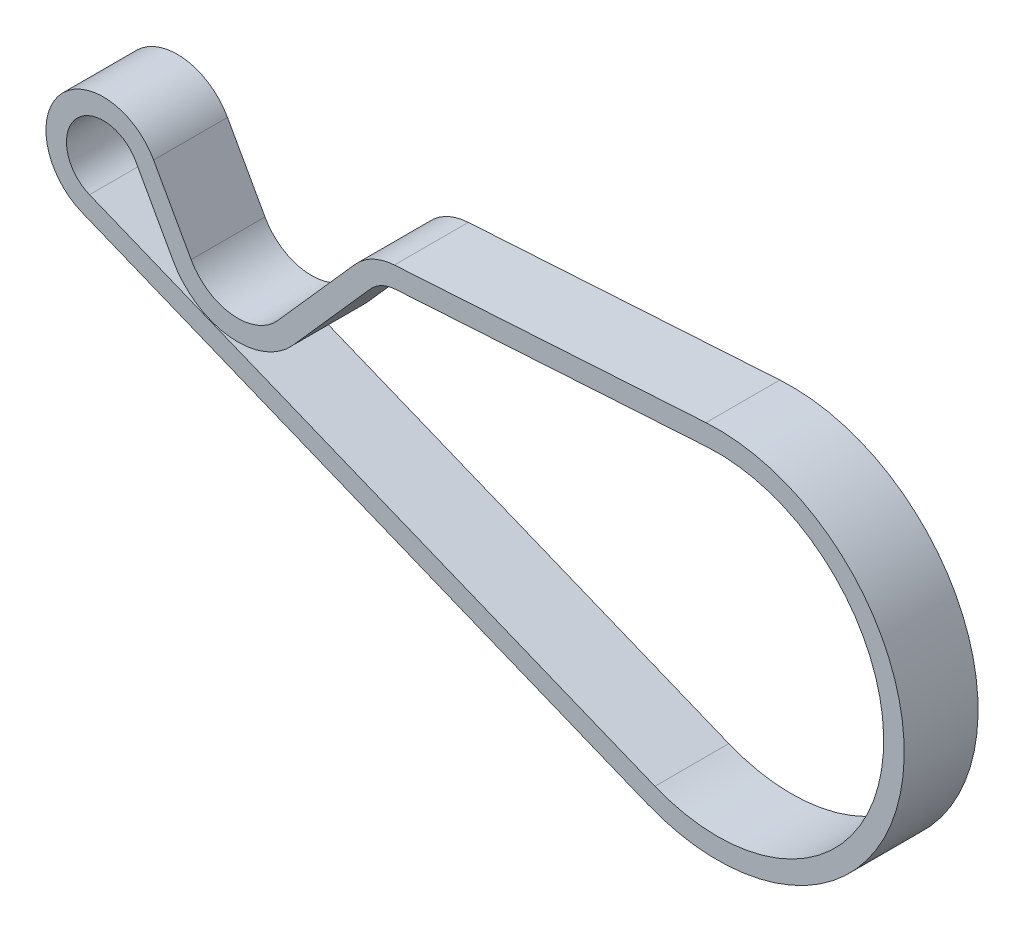
ISO-10303-21;
HEADER;
FILE_DESCRIPTION(('STEP AP214'),'2;1');
FILE_NAME('part.step','',(''),(''),'','','');
FILE_SCHEMA(('AUTOMOTIVE_DESIGN { 1 0 10303 214 1 1 1 1 }'));
ENDSEC;
DATA;
#1=APPLICATION_CONTEXT('core data for automotive mechanical design processes');
#2=APPLICATION_PROTOCOL_DEFINITION('international standard','automotive_design',2000,#1);
#3=PRODUCT_CONTEXT('',#1,'mechanical');
#4=PRODUCT('Part','Part','',(#3));
#5=PRODUCT_RELATED_PRODUCT_CATEGORY('part','',(#4));
#6=PRODUCT_DEFINITION_FORMATION('','',#4);
#7=PRODUCT_DEFINITION_CONTEXT('part definition',#1,'design');
#8=PRODUCT_DEFINITION('design','',#6,#7);
#9=PRODUCT_DEFINITION_SHAPE('','',#8);
#10=(LENGTH_UNIT() NAMED_UNIT(*) SI_UNIT(.MILLI.,.METRE.));
#11=(NAMED_UNIT(*) PLANE_ANGLE_UNIT() SI_UNIT($,.RADIAN.));
#12=(NAMED_UNIT(*) SI_UNIT($,.STERADIAN.) SOLID_ANGLE_UNIT());
#13=UNCERTAINTY_MEASURE_WITH_UNIT(LENGTH_MEASURE(1.E-05),#10,'distance_accuracy_value','');
#14=(GEOMETRIC_REPRESENTATION_CONTEXT(3) GLOBAL_UNCERTAINTY_ASSIGNED_CONTEXT((#13)) GLOBAL_UNIT_ASSIGNED_CONTEXT((#10,
#11,#12)) REPRESENTATION_CONTEXT('',''));
#15=CARTESIAN_POINT('',(0.,0.,0.));
#16=DIRECTION('',(0.,0.,1.));
#17=DIRECTION('',(1.,0.,0.));
#18=AXIS2_PLACEMENT_3D('',#15,#16,#17);
#19=CARTESIAN_POINT('',(-65.5499999999999,-44.3800000000003,-8.));
#20=DIRECTION('',(0.,0.,1.));
#21=DIRECTION('',(1.,0.,0.));
#22=AXIS2_PLACEMENT_3D('',#19,#20,#21);
#23=CYLINDRICAL_SURFACE('',#22,28.);
#24=DIRECTION('',(0.,0.,1.));
#25=VECTOR('',#24,1.);
#26=CARTESIAN_POINT('',(-76.0823695886339,-70.3235770634743,-8.));
#27=LINE('',#26,#25);
#28=CARTESIAN_POINT('',(-76.0823695886339,-70.3235770634743,-8.));
#29=VERTEX_POINT('',#28);
#30=CARTESIAN_POINT('',(-76.0823695886339,-70.3235770634743,28.));
#31=VERTEX_POINT('',#30);
#32=EDGE_CURVE('E136',#29,#31,#27,.T.);
#33=ORIENTED_EDGE('',*,*,#32,.T.);
#34=CARTESIAN_POINT('',(-65.5499999999999,-44.3800000000003,28.));
#35=DIRECTION('',(0.,0.,1.));
#36=DIRECTION('',(1.,0.,0.));
#37=AXIS2_PLACEMENT_3D('',#34,#35,#36);
#38=CIRCLE('',#37,28.);
#39=CARTESIAN_POINT('',(-41.0672560545717,-30.7934165846381,28.));
#40=VERTEX_POINT('',#39);
#41=EDGE_CURVE('E289',#40,#31,#38,.T.);
#42=ORIENTED_EDGE('',*,*,#41,.F.);
#43=DIRECTION('',(0.,0.,1.));
#44=VECTOR('',#43,1.);
#45=CARTESIAN_POINT('',(-41.0672560545717,-30.7934165846381,-8.));
#46=LINE('',#45,#44);
#47=CARTESIAN_POINT('',(-41.0672560545717,-30.7934165846381,-8.));
#48=VERTEX_POINT('',#47);
#49=EDGE_CURVE('E12',#48,#40,#46,.T.);
#50=ORIENTED_EDGE('',*,*,#49,.F.);
#51=CARTESIAN_POINT('',(-65.5499999999999,-44.3800000000003,-8.));
#52=DIRECTION('',(0.,0.,1.));
#53=DIRECTION('',(1.,0.,0.));
#54=AXIS2_PLACEMENT_3D('',#51,#52,#53);
#55=CIRCLE('',#54,28.);
#56=EDGE_CURVE('E332',#48,#29,#55,.T.);
#57=ORIENTED_EDGE('',*,*,#56,.T.);
#58=EDGE_LOOP('',(#33,#42,#50,#57));
#59=FACE_BOUND('',#58,.T.);
#60=ADVANCED_FACE('F133',(#59),#23,.T.);
#61=CARTESIAN_POINT('',(-41.0672560545717,-30.7934165846381,-8.));
#62=DIRECTION('',(0.874383712336724,0.485235121977221,0.));
#63=DIRECTION('',(-0.485235121977221,0.874383712336724,0.));
#64=AXIS2_PLACEMENT_3D('',#61,#62,#63);
#65=PLANE('',#64);
#66=ORIENTED_EDGE('',*,*,#49,.T.);
#67=DIRECTION('',(-0.485235121977221,0.874383712336724,0.));
#68=VECTOR('',#67,1.);
#69=CARTESIAN_POINT('',(-41.0672560545717,-30.7934165846381,28.));
#70=LINE('',#69,#68);
#71=CARTESIAN_POINT('',(-22.8135163058124,-63.6862802761865,28.));
#72=VERTEX_POINT('',#71);
#73=EDGE_CURVE('E310',#72,#40,#70,.T.);
#74=ORIENTED_EDGE('',*,*,#73,.F.);
#75=DIRECTION('',(0.,0.,1.));
#76=VECTOR('',#75,1.);
#77=CARTESIAN_POINT('',(-22.8135163058124,-63.6862802761865,-8.));
#78=LINE('',#77,#76);
#79=CARTESIAN_POINT('',(-22.8135163058124,-63.6862802761865,-8.));
#80=VERTEX_POINT('',#79);
#81=EDGE_CURVE('E141',#80,#72,#78,.T.);
#82=ORIENTED_EDGE('',*,*,#81,.F.);
#83=DIRECTION('',(-0.485235121977221,0.874383712336724,0.));
#84=VECTOR('',#83,1.);
#85=CARTESIAN_POINT('',(-41.0672560545717,-30.7934165846381,-8.));
#86=LINE('',#85,#84);
#87=EDGE_CURVE('E363',#80,#48,#86,.T.);
#88=ORIENTED_EDGE('',*,*,#87,.T.);
#89=EDGE_LOOP('',(#66,#74,#82,#88));
#90=FACE_BOUND('',#89,.T.);
#91=ADVANCED_FACE('F384',(#90),#65,.T.);
#92=CARTESIAN_POINT('',(-0.0795397850575346,-51.0701671047787,-8.));
#93=DIRECTION('',(0.,0.,1.));
#94=DIRECTION('',(1.,0.,0.));
#95=AXIS2_PLACEMENT_3D('',#92,#93,#94);
#96=CYLINDRICAL_SURFACE('',#95,26.);
#97=ORIENTED_EDGE('',*,*,#81,.T.);
#98=CARTESIAN_POINT('',(-0.0795397850575346,-51.0701671047787,28.));
#99=DIRECTION('',(0.,0.,1.));
#100=DIRECTION('',(1.,0.,0.));
#101=AXIS2_PLACEMENT_3D('',#98,#99,#100);
#102=CIRCLE('',#101,26.);
#103=CARTESIAN_POINT('',(19.3835661686755,-68.3092943052422,28.));
#104=VERTEX_POINT('',#103);
#105=EDGE_CURVE('E307',#104,#72,#102,.F.);
#106=ORIENTED_EDGE('',*,*,#105,.F.);
#107=DIRECTION('',(0.,0.,1.));
#108=VECTOR('',#107,1.);
#109=CARTESIAN_POINT('',(19.3835661686755,-68.3092943052422,-8.));
#110=LINE('',#109,#108);
#111=CARTESIAN_POINT('',(19.3835661686755,-68.3092943052422,-8.));
#112=VERTEX_POINT('',#111);
#113=EDGE_CURVE('E367',#112,#104,#110,.T.);
#114=ORIENTED_EDGE('',*,*,#113,.F.);
#115=CARTESIAN_POINT('',(-0.0795397850575346,-51.0701671047787,-8.));
#116=DIRECTION('',(0.,0.,1.));
#117=DIRECTION('',(1.,0.,0.));
#118=AXIS2_PLACEMENT_3D('',#115,#116,#117);
#119=CIRCLE('',#118,26.);
#120=EDGE_CURVE('E360',#112,#80,#119,.F.);
#121=ORIENTED_EDGE('',*,*,#120,.T.);
#122=EDGE_LOOP('',(#97,#106,#114,#121));
#123=FACE_BOUND('',#122,.T.);
#124=ADVANCED_FACE('F405',(#123),#96,.F.);
#125=CARTESIAN_POINT('',(19.3835661686756,-68.3092943052422,-8.));
#126=DIRECTION('',(-0.748580998220504,0.66304335386398,0.));
#127=DIRECTION('',(-0.66304335386398,-0.748580998220504,0.));
#128=AXIS2_PLACEMENT_3D('',#125,#126,#127);
#129=PLANE('',#128);
#130=ORIENTED_EDGE('',*,*,#113,.T.);
#131=DIRECTION('',(-0.66304335386398,-0.748580998220504,0.));
#132=VECTOR('',#131,1.);
#133=CARTESIAN_POINT('',(19.3835661686756,-68.3092943052422,28.));
#134=LINE('',#133,#132);
#135=CARTESIAN_POINT('',(57.0223805569812,-25.8147860918106,28.));
#136=VERTEX_POINT('',#135);
#137=EDGE_CURVE('E304',#136,#104,#134,.T.);
#138=ORIENTED_EDGE('',*,*,#137,.F.);
#139=DIRECTION('',(0.,0.,1.));
#140=VECTOR('',#139,1.);
#141=CARTESIAN_POINT('',(57.0223805569812,-25.8147860918106,-8.));
#142=LINE('',#141,#140);
#143=CARTESIAN_POINT('',(57.0223805569812,-25.8147860918106,-8.));
#144=VERTEX_POINT('',#143);
#145=EDGE_CURVE('E369',#144,#136,#142,.T.);
#146=ORIENTED_EDGE('',*,*,#145,.F.);
#147=DIRECTION('',(-0.66304335386398,-0.748580998220504,0.));
#148=VECTOR('',#147,1.);
#149=CARTESIAN_POINT('',(19.3835661686756,-68.3092943052422,-8.));
#150=LINE('',#149,#148);
#151=EDGE_CURVE('E357',#144,#112,#150,.T.);
#152=ORIENTED_EDGE('',*,*,#151,.T.);
#153=EDGE_LOOP('',(#130,#138,#146,#152));
#154=FACE_BOUND('',#153,.T.);
#155=ADVANCED_FACE('F402',(#154),#129,.T.);
#156=CARTESIAN_POINT('',(77.9826485071553,-44.380000000002,-8.));
#157=DIRECTION('',(0.,0.,1.));
#158=DIRECTION('',(1.,0.,0.));
#159=AXIS2_PLACEMENT_3D('',#156,#157,#158);
#160=CYLINDRICAL_SURFACE('',#159,28.);
#161=ORIENTED_EDGE('',*,*,#145,.T.);
#162=CARTESIAN_POINT('',(77.9826485071553,-44.380000000002,28.));
#163=DIRECTION('',(0.,0.,1.));
#164=DIRECTION('',(1.,0.,0.));
#165=AXIS2_PLACEMENT_3D('',#162,#163,#164);
#166=CIRCLE('',#165,28.);
#167=CARTESIAN_POINT('',(76.2553410127207,-16.433329199714,28.));
#168=VERTEX_POINT('',#167);
#169=EDGE_CURVE('E301',#168,#136,#166,.T.);
#170=ORIENTED_EDGE('',*,*,#169,.F.);
#171=DIRECTION('',(0.,0.,1.));
#172=VECTOR('',#171,1.);
#173=CARTESIAN_POINT('',(76.2553410127207,-16.433329199714,-7.99999999999999));
#174=LINE('',#173,#172);
#175=CARTESIAN_POINT('',(76.2553410127207,-16.433329199714,-7.99999999999999));
#176=VERTEX_POINT('',#175);
#177=EDGE_CURVE('E371',#176,#168,#174,.T.);
#178=ORIENTED_EDGE('',*,*,#177,.F.);
#179=CARTESIAN_POINT('',(77.9826485071553,-44.380000000002,-8.));
#180=DIRECTION('',(0.,0.,1.));
#181=DIRECTION('',(1.,0.,0.));
#182=AXIS2_PLACEMENT_3D('',#179,#180,#181);
#183=CIRCLE('',#182,28.);
#184=EDGE_CURVE('E354',#176,#144,#183,.T.);
#185=ORIENTED_EDGE('',*,*,#184,.T.);
#186=EDGE_LOOP('',(#161,#170,#178,#185));
#187=FACE_BOUND('',#186,.T.);
#188=ADVANCED_FACE('F400',(#187),#160,.T.);
#189=CARTESIAN_POINT('',(228.091165060952,-7.04877106481592,-8.));
#190=DIRECTION('',(-0.0616895533726637,0.998095385724571,0.));
#191=DIRECTION('',(-0.998095385724572,-0.0616895533726638,0.));
#192=AXIS2_PLACEMENT_3D('',#189,#190,#191);
#193=PLANE('',#192);
#194=ORIENTED_EDGE('',*,*,#177,.T.);
#195=DIRECTION('',(-0.998095385724572,-0.0616895533726638,0.));
#196=VECTOR('',#195,1.);
#197=CARTESIAN_POINT('',(228.091165060952,-7.04877106481592,28.));
#198=LINE('',#197,#196);
#199=CARTESIAN_POINT('',(228.091165060952,-7.04877106481593,28.));
#200=VERTEX_POINT('',#199);
#201=EDGE_CURVE('E298',#200,#168,#198,.T.);
#202=ORIENTED_EDGE('',*,*,#201,.F.);
#203=DIRECTION('',(0.,0.,1.));
#204=VECTOR('',#203,1.);
#205=CARTESIAN_POINT('',(228.091165060952,-7.04877106481593,-8.));
#206=LINE('',#205,#204);
#207=CARTESIAN_POINT('',(228.091165060952,-7.04877106481593,-8.));
#208=VERTEX_POINT('',#207);
#209=EDGE_CURVE('E373',#208,#200,#206,.T.);
#210=ORIENTED_EDGE('',*,*,#209,.F.);
#211=DIRECTION('',(-0.998095385724572,-0.0616895533726638,0.));
#212=VECTOR('',#211,1.);
#213=CARTESIAN_POINT('',(228.091165060952,-7.04877106481592,-8.));
#214=LINE('',#213,#212);
#215=EDGE_CURVE('E351',#208,#176,#214,.T.);
#216=ORIENTED_EDGE('',*,*,#215,.T.);
#217=EDGE_LOOP('',(#194,#202,#210,#216));
#218=FACE_BOUND('',#217,.T.);
#219=ADVANCED_FACE('F398',(#218),#193,.T.);
#220=CARTESIAN_POINT('',(233.704914417864,-97.8754511657519,-8.));
#221=DIRECTION('',(0.,0.,1.));
#222=DIRECTION('',(1.,0.,0.));
#223=AXIS2_PLACEMENT_3D('',#220,#221,#222);
#224=CYLINDRICAL_SURFACE('',#223,91.);
#225=ORIENTED_EDGE('',*,*,#209,.T.);
#226=CARTESIAN_POINT('',(233.704914417864,-97.8754511657519,28.));
#227=DIRECTION('',(0.,0.,1.));
#228=DIRECTION('',(1.,0.,0.));
#229=AXIS2_PLACEMENT_3D('',#226,#227,#228);
#230=CIRCLE('',#229,91.);
#231=CARTESIAN_POINT('',(199.474713254804,-182.192076622043,28.));
#232=VERTEX_POINT('',#231);
#233=EDGE_CURVE('E295',#232,#200,#230,.T.);
#234=ORIENTED_EDGE('',*,*,#233,.F.);
#235=DIRECTION('',(0.,0.,1.));
#236=VECTOR('',#235,1.);
#237=CARTESIAN_POINT('',(199.474713254804,-182.192076622043,-8.));
#238=LINE('',#237,#236);
#239=CARTESIAN_POINT('',(199.474713254804,-182.192076622043,-8.));
#240=VERTEX_POINT('',#239);
#241=EDGE_CURVE('E374',#240,#232,#238,.T.);
#242=ORIENTED_EDGE('',*,*,#241,.F.);
#243=CARTESIAN_POINT('',(233.704914417864,-97.8754511657519,-8.));
#244=DIRECTION('',(0.,0.,1.));
#245=DIRECTION('',(1.,0.,0.));
#246=AXIS2_PLACEMENT_3D('',#243,#244,#245);
#247=CIRCLE('',#246,91.);
#248=EDGE_CURVE('E348',#240,#208,#247,.T.);
#249=ORIENTED_EDGE('',*,*,#248,.T.);
#250=EDGE_LOOP('',(#225,#234,#242,#249));
#251=FACE_BOUND('',#250,.T.);
#252=ADVANCED_FACE('F394',(#251),#224,.T.);
#253=CARTESIAN_POINT('',(-76.0823695886339,-70.3235770634743,-8.));
#254=DIRECTION('',(-0.376156056736929,-0.926556323695502,0.));
#255=DIRECTION('',(0.926556323695502,-0.376156056736929,0.));
#256=AXIS2_PLACEMENT_3D('',#253,#254,#255);
#257=PLANE('',#256);
#258=ORIENTED_EDGE('',*,*,#241,.T.);
#259=DIRECTION('',(0.926556323695502,-0.376156056736929,0.));
#260=VECTOR('',#259,1.);
#261=CARTESIAN_POINT('',(-76.0823695886339,-70.3235770634743,28.));
#262=LINE('',#261,#260);
#263=EDGE_CURVE('E292',#31,#232,#262,.T.);
#264=ORIENTED_EDGE('',*,*,#263,.F.);
#265=ORIENTED_EDGE('',*,*,#32,.F.);
#266=DIRECTION('',(0.926556323695502,-0.376156056736929,0.));
#267=VECTOR('',#266,1.);
#268=CARTESIAN_POINT('',(-76.0823695886339,-70.3235770634743,-8.));
#269=LINE('',#268,#267);
#270=EDGE_CURVE('E345',#29,#240,#269,.T.);
#271=ORIENTED_EDGE('',*,*,#270,.T.);
#272=EDGE_LOOP('',(#258,#264,#265,#271));
#273=FACE_BOUND('',#272,.T.);
#274=ADVANCED_FACE('F378',(#273),#257,.T.);
#275=CARTESIAN_POINT('',(-65.5499999999999,-44.3800000000003,-8.));
#276=DIRECTION('',(0.,0.,1.));
#277=DIRECTION('',(1.,0.,0.));
#278=AXIS2_PLACEMENT_3D('',#275,#276,#277);
#279=PLANE('',#278);
#280=DIRECTION('',(-0.485235121977221,0.874383712336724,0.));
#281=VECTOR('',#280,1.);
#282=CARTESIAN_POINT('',(-49.8110931779389,-35.6457678044103,-8.));
#283=LINE('',#282,#281);
#284=CARTESIAN_POINT('',(-31.5573534291796,-68.5386314959587,-8.));
#285=VERTEX_POINT('',#284);
#286=CARTESIAN_POINT('',(-49.8110931779389,-35.6457678044103,-8.));
#287=VERTEX_POINT('',#286);
#288=EDGE_CURVE('E258',#285,#287,#283,.T.);
#289=ORIENTED_EDGE('',*,*,#288,.T.);
#290=CARTESIAN_POINT('',(-65.5499999999999,-44.3800000000003,-8.));
#291=DIRECTION('',(0.,0.,1.));
#292=DIRECTION('',(1.,0.,0.));
#293=AXIS2_PLACEMENT_3D('',#290,#291,#292);
#294=CIRCLE('',#293,18.);
#295=CARTESIAN_POINT('',(-72.3208090212647,-61.0580138265193,-8.));
#296=VERTEX_POINT('',#295);
#297=EDGE_CURVE('E313',#287,#296,#294,.T.);
#298=ORIENTED_EDGE('',*,*,#297,.T.);
#299=DIRECTION('',(0.926556323695502,-0.376156056736929,0.));
#300=VECTOR('',#299,1.);
#301=CARTESIAN_POINT('',(-72.3208090212647,-61.0580138265193,-8.));
#302=LINE('',#301,#300);
#303=CARTESIAN_POINT('',(203.236273822173,-172.926513385088,-8.));
#304=VERTEX_POINT('',#303);
#305=EDGE_CURVE('E253',#296,#304,#302,.T.);
#306=ORIENTED_EDGE('',*,*,#305,.T.);
#307=CARTESIAN_POINT('',(233.704914417864,-97.8754511657519,-8.));
#308=DIRECTION('',(0.,0.,1.));
#309=DIRECTION('',(1.,0.,0.));
#310=AXIS2_PLACEMENT_3D('',#307,#308,#309);
#311=CIRCLE('',#310,81.);
#312=CARTESIAN_POINT('',(228.708060594679,-17.0297249220617,-8.));
#313=VERTEX_POINT('',#312);
#314=EDGE_CURVE('E149',#304,#313,#311,.T.);
#315=ORIENTED_EDGE('',*,*,#314,.T.);
#316=DIRECTION('',(-0.998095385724572,-0.0616895533726638,0.));
#317=VECTOR('',#316,1.);
#318=CARTESIAN_POINT('',(228.708060594679,-17.0297249220616,-8.));
#319=LINE('',#318,#317);
#320=CARTESIAN_POINT('',(76.8722365464473,-26.4142830569597,-7.99999999999999));
#321=VERTEX_POINT('',#320);
#322=EDGE_CURVE('E317',#313,#321,#319,.T.);
#323=ORIENTED_EDGE('',*,*,#322,.T.);
#324=CARTESIAN_POINT('',(77.9826485071553,-44.380000000002,-8.));
#325=DIRECTION('',(0.,0.,1.));
#326=DIRECTION('',(1.,0.,0.));
#327=AXIS2_PLACEMENT_3D('',#324,#325,#326);
#328=CIRCLE('',#327,18.);
#329=CARTESIAN_POINT('',(64.5081905391862,-32.4452196304504,-8.));
#330=VERTEX_POINT('',#329);
#331=EDGE_CURVE('E320',#321,#330,#328,.T.);
#332=ORIENTED_EDGE('',*,*,#331,.T.);
#333=DIRECTION('',(-0.66304335386398,-0.748580998220504,0.));
#334=VECTOR('',#333,1.);
#335=CARTESIAN_POINT('',(26.8693761508806,-74.939727843882,-8.));
#336=LINE('',#335,#334);
#337=CARTESIAN_POINT('',(26.8693761508806,-74.939727843882,-8.));
#338=VERTEX_POINT('',#337);
#339=EDGE_CURVE('E323',#330,#338,#336,.T.);
#340=ORIENTED_EDGE('',*,*,#339,.T.);
#341=CARTESIAN_POINT('',(-0.0795397850575346,-51.0701671047787,-8.));
#342=DIRECTION('',(0.,0.,1.));
#343=DIRECTION('',(1.,0.,0.));
#344=AXIS2_PLACEMENT_3D('',#341,#342,#343);
#345=CIRCLE('',#344,36.);
#346=EDGE_CURVE('E326',#338,#285,#345,.F.);
#347=ORIENTED_EDGE('',*,*,#346,.T.);
#348=EDGE_LOOP('',(#289,#298,#306,#315,#323,#332,#340,#347));
#349=FACE_BOUND('',#348,.T.);
#350=ORIENTED_EDGE('',*,*,#56,.F.);
#351=ORIENTED_EDGE('',*,*,#87,.F.);
#352=ORIENTED_EDGE('',*,*,#120,.F.);
#353=ORIENTED_EDGE('',*,*,#151,.F.);
#354=ORIENTED_EDGE('',*,*,#184,.F.);
#355=ORIENTED_EDGE('',*,*,#215,.F.);
#356=ORIENTED_EDGE('',*,*,#248,.F.);
#357=ORIENTED_EDGE('',*,*,#270,.F.);
#358=EDGE_LOOP('',(#350,#351,#352,#353,#354,#355,#356,#357));
#359=FACE_BOUND('',#358,.T.);
#360=ADVANCED_FACE('F388',(#349,#359),#279,.F.);
#361=CARTESIAN_POINT('',(-65.5499999999999,-44.3800000000003,-8.));
#362=DIRECTION('',(0.,0.,1.));
#363=DIRECTION('',(1.,0.,0.));
#364=AXIS2_PLACEMENT_3D('',#361,#362,#363);
#365=CYLINDRICAL_SURFACE('',#364,18.);
#366=DIRECTION('',(0.,0.,1.));
#367=VECTOR('',#366,1.);
#368=CARTESIAN_POINT('',(-49.8110931779389,-35.6457678044103,-8.));
#369=LINE('',#368,#367);
#370=CARTESIAN_POINT('',(-49.8110931779389,-35.6457678044103,28.));
#371=VERTEX_POINT('',#370);
#372=EDGE_CURVE('E263',#287,#371,#369,.T.);
#373=ORIENTED_EDGE('',*,*,#372,.T.);
#374=CARTESIAN_POINT('',(-65.5499999999999,-44.3800000000003,28.));
#375=DIRECTION('',(0.,0.,1.));
#376=DIRECTION('',(1.,0.,0.));
#377=AXIS2_PLACEMENT_3D('',#374,#375,#376);
#378=CIRCLE('',#377,18.);
#379=CARTESIAN_POINT('',(-72.3208090212647,-61.0580138265193,28.));
#380=VERTEX_POINT('',#379);
#381=EDGE_CURVE('E261',#371,#380,#378,.T.);
#382=ORIENTED_EDGE('',*,*,#381,.T.);
#383=DIRECTION('',(0.,0.,1.));
#384=VECTOR('',#383,1.);
#385=CARTESIAN_POINT('',(-72.3208090212647,-61.0580138265193,-8.));
#386=LINE('',#385,#384);
#387=EDGE_CURVE('E246',#296,#380,#386,.T.);
#388=ORIENTED_EDGE('',*,*,#387,.F.);
#389=ORIENTED_EDGE('',*,*,#297,.F.);
#390=EDGE_LOOP('',(#373,#382,#388,#389));
#391=FACE_BOUND('',#390,.T.);
#392=ADVANCED_FACE('F262',(#391),#365,.F.);
#393=CARTESIAN_POINT('',(-49.8110931779389,-35.6457678044103,-8.));
#394=DIRECTION('',(0.874383712336724,0.485235121977221,0.));
#395=DIRECTION('',(-0.485235121977221,0.874383712336724,0.));
#396=AXIS2_PLACEMENT_3D('',#393,#394,#395);
#397=PLANE('',#396);
#398=DIRECTION('',(0.,0.,1.));
#399=VECTOR('',#398,1.);
#400=CARTESIAN_POINT('',(-31.5573534291796,-68.5386314959587,-8.));
#401=LINE('',#400,#399);
#402=CARTESIAN_POINT('',(-31.5573534291796,-68.5386314959587,28.));
#403=VERTEX_POINT('',#402);
#404=EDGE_CURVE('E333',#285,#403,#401,.T.);
#405=ORIENTED_EDGE('',*,*,#404,.T.);
#406=DIRECTION('',(-0.485235121977221,0.874383712336724,0.));
#407=VECTOR('',#406,1.);
#408=CARTESIAN_POINT('',(-49.8110931779389,-35.6457678044103,28.));
#409=LINE('',#408,#407);
#410=EDGE_CURVE('E287',#403,#371,#409,.T.);
#411=ORIENTED_EDGE('',*,*,#410,.T.);
#412=ORIENTED_EDGE('',*,*,#372,.F.);
#413=ORIENTED_EDGE('',*,*,#288,.F.);
#414=EDGE_LOOP('',(#405,#411,#412,#413));
#415=FACE_BOUND('',#414,.T.);
#416=ADVANCED_FACE('F480',(#415),#397,.F.);
#417=CARTESIAN_POINT('',(-0.0795397850575346,-51.0701671047787,-8.));
#418=DIRECTION('',(0.,0.,1.));
#419=DIRECTION('',(1.,0.,0.));
#420=AXIS2_PLACEMENT_3D('',#417,#418,#419);
#421=CYLINDRICAL_SURFACE('',#420,36.);
#422=DIRECTION('',(0.,0.,1.));
#423=VECTOR('',#422,1.);
#424=CARTESIAN_POINT('',(26.8693761508806,-74.939727843882,-8.));
#425=LINE('',#424,#423);
#426=CARTESIAN_POINT('',(26.8693761508806,-74.939727843882,28.));
#427=VERTEX_POINT('',#426);
#428=EDGE_CURVE('E335',#338,#427,#425,.T.);
#429=ORIENTED_EDGE('',*,*,#428,.T.);
#430=CARTESIAN_POINT('',(-0.0795397850575346,-51.0701671047787,28.));
#431=DIRECTION('',(0.,0.,1.));
#432=DIRECTION('',(1.,0.,0.));
#433=AXIS2_PLACEMENT_3D('',#430,#431,#432);
#434=CIRCLE('',#433,36.);
#435=EDGE_CURVE('E284',#427,#403,#434,.F.);
#436=ORIENTED_EDGE('',*,*,#435,.T.);
#437=ORIENTED_EDGE('',*,*,#404,.F.);
#438=ORIENTED_EDGE('',*,*,#346,.F.);
#439=EDGE_LOOP('',(#429,#436,#437,#438));
#440=FACE_BOUND('',#439,.T.);
#441=ADVANCED_FACE('F489',(#440),#421,.T.);
#442=CARTESIAN_POINT('',(26.8693761508806,-74.939727843882,-8.));
#443=DIRECTION('',(-0.748580998220504,0.66304335386398,0.));
#444=DIRECTION('',(-0.66304335386398,-0.748580998220504,0.));
#445=AXIS2_PLACEMENT_3D('',#442,#443,#444);
#446=PLANE('',#445);
#447=DIRECTION('',(0.,0.,1.));
#448=VECTOR('',#447,1.);
#449=CARTESIAN_POINT('',(64.5081905391862,-32.4452196304504,-8.));
#450=LINE('',#449,#448);
#451=CARTESIAN_POINT('',(64.5081905391862,-32.4452196304504,28.));
#452=VERTEX_POINT('',#451);
#453=EDGE_CURVE('E337',#330,#452,#450,.T.);
#454=ORIENTED_EDGE('',*,*,#453,.T.);
#455=DIRECTION('',(-0.66304335386398,-0.748580998220504,0.));
#456=VECTOR('',#455,1.);
#457=CARTESIAN_POINT('',(26.8693761508806,-74.939727843882,28.));
#458=LINE('',#457,#456);
#459=EDGE_CURVE('E281',#452,#427,#458,.T.);
#460=ORIENTED_EDGE('',*,*,#459,.T.);
#461=ORIENTED_EDGE('',*,*,#428,.F.);
#462=ORIENTED_EDGE('',*,*,#339,.F.);
#463=EDGE_LOOP('',(#454,#460,#461,#462));
#464=FACE_BOUND('',#463,.T.);
#465=ADVANCED_FACE('F499',(#464),#446,.F.);
#466=CARTESIAN_POINT('',(77.9826485071553,-44.380000000002,-8.));
#467=DIRECTION('',(0.,0.,1.));
#468=DIRECTION('',(1.,0.,0.));
#469=AXIS2_PLACEMENT_3D('',#466,#467,#468);
#470=CYLINDRICAL_SURFACE('',#469,18.);
#471=DIRECTION('',(0.,0.,1.));
#472=VECTOR('',#471,1.);
#473=CARTESIAN_POINT('',(76.8722365464473,-26.4142830569597,-7.99999999999999));
#474=LINE('',#473,#472);
#475=CARTESIAN_POINT('',(76.8722365464473,-26.4142830569597,28.));
#476=VERTEX_POINT('',#475);
#477=EDGE_CURVE('E339',#321,#476,#474,.T.);
#478=ORIENTED_EDGE('',*,*,#477,.T.);
#479=CARTESIAN_POINT('',(77.9826485071553,-44.380000000002,28.));
#480=DIRECTION('',(0.,0.,1.));
#481=DIRECTION('',(1.,0.,0.));
#482=AXIS2_PLACEMENT_3D('',#479,#480,#481);
#483=CIRCLE('',#482,18.);
#484=EDGE_CURVE('E278',#476,#452,#483,.T.);
#485=ORIENTED_EDGE('',*,*,#484,.T.);
#486=ORIENTED_EDGE('',*,*,#453,.F.);
#487=ORIENTED_EDGE('',*,*,#331,.F.);
#488=EDGE_LOOP('',(#478,#485,#486,#487));
#489=FACE_BOUND('',#488,.T.);
#490=ADVANCED_FACE('F509',(#489),#470,.F.);
#491=CARTESIAN_POINT('',(228.708060594679,-17.0297249220616,-8.));
#492=DIRECTION('',(-0.0616895533726637,0.998095385724571,0.));
#493=DIRECTION('',(-0.998095385724572,-0.0616895533726638,0.));
#494=AXIS2_PLACEMENT_3D('',#491,#492,#493);
#495=PLANE('',#494);
#496=DIRECTION('',(0.,0.,1.));
#497=VECTOR('',#496,1.);
#498=CARTESIAN_POINT('',(228.708060594679,-17.0297249220617,-8.));
#499=LINE('',#498,#497);
#500=CARTESIAN_POINT('',(228.708060594679,-17.0297249220617,28.));
#501=VERTEX_POINT('',#500);
#502=EDGE_CURVE('E341',#313,#501,#499,.T.);
#503=ORIENTED_EDGE('',*,*,#502,.T.);
#504=DIRECTION('',(-0.998095385724572,-0.0616895533726638,0.));
#505=VECTOR('',#504,1.);
#506=CARTESIAN_POINT('',(228.708060594679,-17.0297249220616,28.));
#507=LINE('',#506,#505);
#508=EDGE_CURVE('E273',#501,#476,#507,.T.);
#509=ORIENTED_EDGE('',*,*,#508,.T.);
#510=ORIENTED_EDGE('',*,*,#477,.F.);
#511=ORIENTED_EDGE('',*,*,#322,.F.);
#512=EDGE_LOOP('',(#503,#509,#510,#511));
#513=FACE_BOUND('',#512,.T.);
#514=ADVANCED_FACE('F519',(#513),#495,.F.);
#515=CARTESIAN_POINT('',(233.704914417864,-97.8754511657519,-8.));
#516=DIRECTION('',(0.,0.,1.));
#517=DIRECTION('',(1.,0.,0.));
#518=AXIS2_PLACEMENT_3D('',#515,#516,#517);
#519=CYLINDRICAL_SURFACE('',#518,81.);
#520=DIRECTION('',(0.,0.,1.));
#521=VECTOR('',#520,1.);
#522=CARTESIAN_POINT('',(203.236273822173,-172.926513385088,-8.));
#523=LINE('',#522,#521);
#524=CARTESIAN_POINT('',(203.236273822173,-172.926513385088,28.));
#525=VERTEX_POINT('',#524);
#526=EDGE_CURVE('E257',#304,#525,#523,.T.);
#527=ORIENTED_EDGE('',*,*,#526,.T.);
#528=CARTESIAN_POINT('',(233.704914417864,-97.8754511657519,28.));
#529=DIRECTION('',(0.,0.,1.));
#530=DIRECTION('',(1.,0.,0.));
#531=AXIS2_PLACEMENT_3D('',#528,#529,#530);
#532=CIRCLE('',#531,81.);
#533=EDGE_CURVE('E271',#525,#501,#532,.T.);
#534=ORIENTED_EDGE('',*,*,#533,.T.);
#535=ORIENTED_EDGE('',*,*,#502,.F.);
#536=ORIENTED_EDGE('',*,*,#314,.F.);
#537=EDGE_LOOP('',(#527,#534,#535,#536));
#538=FACE_BOUND('',#537,.T.);
#539=ADVANCED_FACE('F529',(#538),#519,.F.);
#540=CARTESIAN_POINT('',(-72.3208090212647,-61.0580138265193,-8.));
#541=DIRECTION('',(-0.376156056736929,-0.926556323695502,0.));
#542=DIRECTION('',(0.926556323695502,-0.376156056736929,0.));
#543=AXIS2_PLACEMENT_3D('',#540,#541,#542);
#544=PLANE('',#543);
#545=ORIENTED_EDGE('',*,*,#387,.T.);
#546=DIRECTION('',(0.926556323695502,-0.376156056736929,0.));
#547=VECTOR('',#546,1.);
#548=CARTESIAN_POINT('',(-72.3208090212647,-61.0580138265193,28.));
#549=LINE('',#548,#547);
#550=EDGE_CURVE('E250',#380,#525,#549,.T.);
#551=ORIENTED_EDGE('',*,*,#550,.T.);
#552=ORIENTED_EDGE('',*,*,#526,.F.);
#553=ORIENTED_EDGE('',*,*,#305,.F.);
#554=EDGE_LOOP('',(#545,#551,#552,#553));
#555=FACE_BOUND('',#554,.T.);
#556=ADVANCED_FACE('F248',(#555),#544,.F.);
#557=CARTESIAN_POINT('',(-65.5499999999999,-44.3800000000003,28.));
#558=DIRECTION('',(0.,0.,1.));
#559=DIRECTION('',(1.,0.,0.));
#560=AXIS2_PLACEMENT_3D('',#557,#558,#559);
#561=PLANE('',#560);
#562=ORIENTED_EDGE('',*,*,#41,.T.);
#563=ORIENTED_EDGE('',*,*,#263,.T.);
#564=ORIENTED_EDGE('',*,*,#233,.T.);
#565=ORIENTED_EDGE('',*,*,#201,.T.);
#566=ORIENTED_EDGE('',*,*,#169,.T.);
#567=ORIENTED_EDGE('',*,*,#137,.T.);
#568=ORIENTED_EDGE('',*,*,#105,.T.);
#569=ORIENTED_EDGE('',*,*,#73,.T.);
#570=EDGE_LOOP('',(#562,#563,#564,#565,#566,#567,#568,#569));
#571=FACE_BOUND('',#570,.T.);
#572=ORIENTED_EDGE('',*,*,#550,.F.);
#573=ORIENTED_EDGE('',*,*,#381,.F.);
#574=ORIENTED_EDGE('',*,*,#410,.F.);
#575=ORIENTED_EDGE('',*,*,#435,.F.);
#576=ORIENTED_EDGE('',*,*,#459,.F.);
#577=ORIENTED_EDGE('',*,*,#484,.F.);
#578=ORIENTED_EDGE('',*,*,#508,.F.);
#579=ORIENTED_EDGE('',*,*,#533,.F.);
#580=EDGE_LOOP('',(#572,#573,#574,#575,#576,#577,#578,#579));
#581=FACE_BOUND('',#580,.T.);
#582=ADVANCED_FACE('F268',(#571,#581),#561,.T.);
#583=CLOSED_SHELL('',(#60,#91,#124,#155,#188,#219,#252,#274,#360,#392,#416,#441,#465,#490,#514,
#539,#556,#582));
#584=MANIFOLD_SOLID_BREP('B2',#583);
#585=ADVANCED_BREP_SHAPE_REPRESENTATION('',(#18,#584),#14);
#586=SHAPE_DEFINITION_REPRESENTATION(#9,#585);
ENDSEC;
END-ISO-10303-21;
